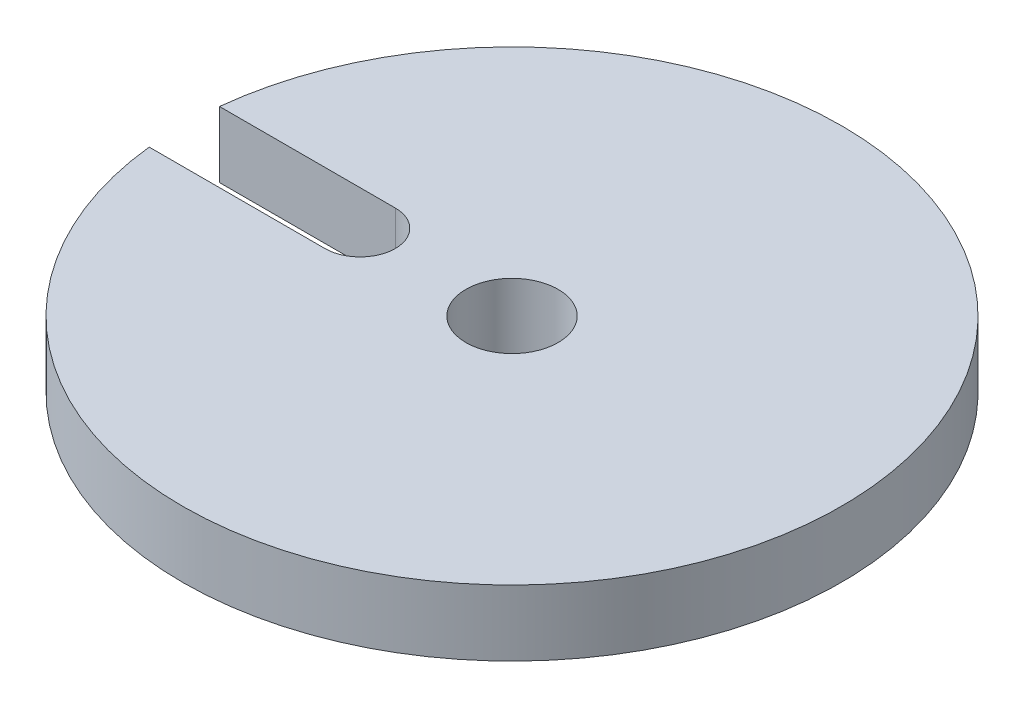
ISO-10303-21;
HEADER;
FILE_DESCRIPTION(('STEP AP214'),'2;1');
FILE_NAME('part.step','',(''),(''),'','','');
FILE_SCHEMA(('AUTOMOTIVE_DESIGN { 1 0 10303 214 1 1 1 1 }'));
ENDSEC;
DATA;
#1=APPLICATION_CONTEXT('core data for automotive mechanical design processes');
#2=APPLICATION_PROTOCOL_DEFINITION('international standard','automotive_design',2000,#1);
#3=PRODUCT_CONTEXT('',#1,'mechanical');
#4=PRODUCT('Part','Part','',(#3));
#5=PRODUCT_RELATED_PRODUCT_CATEGORY('part','',(#4));
#6=PRODUCT_DEFINITION_FORMATION('','',#4);
#7=PRODUCT_DEFINITION_CONTEXT('part definition',#1,'design');
#8=PRODUCT_DEFINITION('design','',#6,#7);
#9=PRODUCT_DEFINITION_SHAPE('','',#8);
#10=(LENGTH_UNIT() NAMED_UNIT(*) SI_UNIT(.MILLI.,.METRE.));
#11=(NAMED_UNIT(*) PLANE_ANGLE_UNIT() SI_UNIT($,.RADIAN.));
#12=(NAMED_UNIT(*) SI_UNIT($,.STERADIAN.) SOLID_ANGLE_UNIT());
#13=UNCERTAINTY_MEASURE_WITH_UNIT(LENGTH_MEASURE(1.E-05),#10,'distance_accuracy_value','');
#14=(GEOMETRIC_REPRESENTATION_CONTEXT(3) GLOBAL_UNCERTAINTY_ASSIGNED_CONTEXT((#13)) GLOBAL_UNIT_ASSIGNED_CONTEXT((#10,
#11,#12)) REPRESENTATION_CONTEXT('',''));
#15=CARTESIAN_POINT('',(0.,0.,0.));
#16=DIRECTION('',(0.,0.,1.));
#17=DIRECTION('',(1.,0.,0.));
#18=AXIS2_PLACEMENT_3D('',#15,#16,#17);
#19=CARTESIAN_POINT('',(0.,3.,0.));
#20=DIRECTION('',(0.,1.,0.));
#21=DIRECTION('',(0.,0.,1.));
#22=AXIS2_PLACEMENT_3D('',#19,#20,#21);
#23=PLANE('',#22);
#24=DIRECTION('',(-1.,0.,0.));
#25=VECTOR('',#24,1.);
#26=CARTESIAN_POINT('',(-14.9144225500017,3.,-1.6));
#27=LINE('',#26,#25);
#28=CARTESIAN_POINT('',(-6.91442255000173,3.,-1.6));
#29=VERTEX_POINT('',#28);
#30=CARTESIAN_POINT('',(-14.9144225500017,3.,-1.6));
#31=VERTEX_POINT('',#30);
#32=EDGE_CURVE('E108',#29,#31,#27,.T.);
#33=ORIENTED_EDGE('',*,*,#32,.F.);
#34=CARTESIAN_POINT('',(-6.91442255000173,3.,0.));
#35=DIRECTION('',(0.,1.,0.));
#36=DIRECTION('',(0.,0.,-1.));
#37=AXIS2_PLACEMENT_3D('',#34,#35,#36);
#38=CIRCLE('',#37,1.6);
#39=CARTESIAN_POINT('',(-6.91442255000173,3.,1.6));
#40=VERTEX_POINT('',#39);
#41=EDGE_CURVE('E90',#40,#29,#38,.T.);
#42=ORIENTED_EDGE('',*,*,#41,.F.);
#43=DIRECTION('',(1.,0.,0.));
#44=VECTOR('',#43,1.);
#45=CARTESIAN_POINT('',(-14.9144225500017,3.,1.6));
#46=LINE('',#45,#44);
#47=CARTESIAN_POINT('',(-14.9144225500017,3.,1.6));
#48=VERTEX_POINT('',#47);
#49=EDGE_CURVE('E77',#48,#40,#46,.T.);
#50=ORIENTED_EDGE('',*,*,#49,.F.);
#51=CARTESIAN_POINT('',(0.,3.,0.));
#52=DIRECTION('',(0.,1.,0.));
#53=DIRECTION('',(0.,0.,1.));
#54=AXIS2_PLACEMENT_3D('',#51,#52,#53);
#55=CIRCLE('',#54,15.);
#56=EDGE_CURVE('E83',#48,#31,#55,.T.);
#57=ORIENTED_EDGE('',*,*,#56,.T.);
#58=EDGE_LOOP('',(#33,#42,#50,#57));
#59=FACE_BOUND('',#58,.T.);
#60=CARTESIAN_POINT('',(0.,3.,0.));
#61=DIRECTION('',(0.,1.,0.));
#62=DIRECTION('',(0.,0.,1.));
#63=AXIS2_PLACEMENT_3D('',#60,#61,#62);
#64=CIRCLE('',#63,2.1);
#65=CARTESIAN_POINT('',(0.,3.,2.1));
#66=VERTEX_POINT('',#65);
#67=EDGE_CURVE('E94',#66,#66,#64,.T.);
#68=ORIENTED_EDGE('',*,*,#67,.F.);
#69=EDGE_LOOP('',(#68));
#70=FACE_BOUND('',#69,.T.);
#71=ADVANCED_FACE('F35',(#59,#70),#23,.T.);
#72=CARTESIAN_POINT('',(0.,0.,0.));
#73=DIRECTION('',(0.,1.,0.));
#74=DIRECTION('',(0.,0.,1.));
#75=AXIS2_PLACEMENT_3D('',#72,#73,#74);
#76=PLANE('',#75);
#77=CARTESIAN_POINT('',(-6.91442255000173,0.,0.));
#78=DIRECTION('',(0.,1.,0.));
#79=DIRECTION('',(0.,0.,1.));
#80=AXIS2_PLACEMENT_3D('',#77,#78,#79);
#81=CIRCLE('',#80,1.6);
#82=CARTESIAN_POINT('',(-6.91442255000173,0.,1.6));
#83=VERTEX_POINT('',#82);
#84=CARTESIAN_POINT('',(-6.91442255000173,0.,-1.6));
#85=VERTEX_POINT('',#84);
#86=EDGE_CURVE('E11',#83,#85,#81,.T.);
#87=ORIENTED_EDGE('',*,*,#86,.T.);
#88=DIRECTION('',(-1.,0.,0.));
#89=VECTOR('',#88,1.);
#90=CARTESIAN_POINT('',(0.,0.,-1.6));
#91=LINE('',#90,#89);
#92=CARTESIAN_POINT('',(-14.9144225500017,0.,-1.6));
#93=VERTEX_POINT('',#92);
#94=EDGE_CURVE('E100',#85,#93,#91,.T.);
#95=ORIENTED_EDGE('',*,*,#94,.T.);
#96=CARTESIAN_POINT('',(0.,0.,0.));
#97=DIRECTION('',(0.,1.,0.));
#98=DIRECTION('',(0.,0.,1.));
#99=AXIS2_PLACEMENT_3D('',#96,#97,#98);
#100=CIRCLE('',#99,15.);
#101=CARTESIAN_POINT('',(-14.9144225500017,0.,1.6));
#102=VERTEX_POINT('',#101);
#103=EDGE_CURVE('E92',#102,#93,#100,.T.);
#104=ORIENTED_EDGE('',*,*,#103,.F.);
#105=DIRECTION('',(1.,0.,0.));
#106=VECTOR('',#105,1.);
#107=CARTESIAN_POINT('',(0.,0.,1.6));
#108=LINE('',#107,#106);
#109=EDGE_CURVE('E50',#102,#83,#108,.T.);
#110=ORIENTED_EDGE('',*,*,#109,.T.);
#111=EDGE_LOOP('',(#87,#95,#104,#110));
#112=FACE_BOUND('',#111,.T.);
#113=CARTESIAN_POINT('',(0.,0.,0.));
#114=DIRECTION('',(0.,1.,0.));
#115=DIRECTION('',(0.,0.,1.));
#116=AXIS2_PLACEMENT_3D('',#113,#114,#115);
#117=CIRCLE('',#116,2.1);
#118=CARTESIAN_POINT('',(0.,0.,2.1));
#119=VERTEX_POINT('',#118);
#120=EDGE_CURVE('E97',#119,#119,#117,.T.);
#121=ORIENTED_EDGE('',*,*,#120,.T.);
#122=EDGE_LOOP('',(#121));
#123=FACE_BOUND('',#122,.T.);
#124=ADVANCED_FACE('F116',(#112,#123),#76,.F.);
#125=CARTESIAN_POINT('',(0.,3.,0.));
#126=DIRECTION('',(0.,-1.,0.));
#127=DIRECTION('',(0.,0.,-1.));
#128=AXIS2_PLACEMENT_3D('',#125,#126,#127);
#129=CYLINDRICAL_SURFACE('',#128,15.);
#130=ORIENTED_EDGE('',*,*,#103,.T.);
#131=DIRECTION('',(0.,-1.,0.));
#132=VECTOR('',#131,1.);
#133=CARTESIAN_POINT('',(-14.9144225500017,3.,-1.6));
#134=LINE('',#133,#132);
#135=EDGE_CURVE('E43',#93,#31,#134,.F.);
#136=ORIENTED_EDGE('',*,*,#135,.T.);
#137=ORIENTED_EDGE('',*,*,#56,.F.);
#138=DIRECTION('',(0.,-1.,0.));
#139=VECTOR('',#138,1.);
#140=CARTESIAN_POINT('',(-14.9144225500017,3.,1.6));
#141=LINE('',#140,#139);
#142=EDGE_CURVE('E74',#48,#102,#141,.T.);
#143=ORIENTED_EDGE('',*,*,#142,.T.);
#144=EDGE_LOOP('',(#130,#136,#137,#143));
#145=FACE_BOUND('',#144,.T.);
#146=ADVANCED_FACE('F37',(#145),#129,.T.);
#147=CARTESIAN_POINT('',(0.,3.,0.));
#148=DIRECTION('',(0.,-1.,0.));
#149=DIRECTION('',(0.,0.,-1.));
#150=AXIS2_PLACEMENT_3D('',#147,#148,#149);
#151=CYLINDRICAL_SURFACE('',#150,2.1);
#152=ORIENTED_EDGE('',*,*,#67,.T.);
#153=EDGE_LOOP('',(#152));
#154=FACE_BOUND('',#153,.T.);
#155=ORIENTED_EDGE('',*,*,#120,.F.);
#156=EDGE_LOOP('',(#155));
#157=FACE_BOUND('',#156,.T.);
#158=ADVANCED_FACE('F121',(#154,#157),#151,.F.);
#159=CARTESIAN_POINT('',(-6.91442255000173,-7.,0.));
#160=DIRECTION('',(0.,1.,0.));
#161=DIRECTION('',(0.,0.,1.));
#162=AXIS2_PLACEMENT_3D('',#159,#160,#161);
#163=CYLINDRICAL_SURFACE('',#162,1.6);
#164=DIRECTION('',(0.,1.,0.));
#165=VECTOR('',#164,1.);
#166=CARTESIAN_POINT('',(-6.91442255000173,-7.,1.6));
#167=LINE('',#166,#165);
#168=EDGE_CURVE('E106',#83,#40,#167,.T.);
#169=ORIENTED_EDGE('',*,*,#168,.T.);
#170=ORIENTED_EDGE('',*,*,#41,.T.);
#171=DIRECTION('',(0.,1.,0.));
#172=VECTOR('',#171,1.);
#173=CARTESIAN_POINT('',(-6.91442255000173,-7.,-1.6));
#174=LINE('',#173,#172);
#175=EDGE_CURVE('E105',#85,#29,#174,.T.);
#176=ORIENTED_EDGE('',*,*,#175,.F.);
#177=ORIENTED_EDGE('',*,*,#86,.F.);
#178=EDGE_LOOP('',(#169,#170,#176,#177));
#179=FACE_BOUND('',#178,.T.);
#180=ADVANCED_FACE('F113',(#179),#163,.F.);
#181=CARTESIAN_POINT('',(-14.9144225500017,-7.,-1.6));
#182=DIRECTION('',(0.,0.,-1.));
#183=DIRECTION('',(-1.,0.,0.));
#184=AXIS2_PLACEMENT_3D('',#181,#182,#183);
#185=PLANE('',#184);
#186=ORIENTED_EDGE('',*,*,#175,.T.);
#187=ORIENTED_EDGE('',*,*,#32,.T.);
#188=ORIENTED_EDGE('',*,*,#135,.F.);
#189=ORIENTED_EDGE('',*,*,#94,.F.);
#190=EDGE_LOOP('',(#186,#187,#188,#189));
#191=FACE_BOUND('',#190,.T.);
#192=ADVANCED_FACE('F114',(#191),#185,.F.);
#193=CARTESIAN_POINT('',(-14.9144225500017,-7.,1.6));
#194=DIRECTION('',(0.,0.,1.));
#195=DIRECTION('',(1.,0.,0.));
#196=AXIS2_PLACEMENT_3D('',#193,#194,#195);
#197=PLANE('',#196);
#198=ORIENTED_EDGE('',*,*,#142,.F.);
#199=ORIENTED_EDGE('',*,*,#49,.T.);
#200=ORIENTED_EDGE('',*,*,#168,.F.);
#201=ORIENTED_EDGE('',*,*,#109,.F.);
#202=EDGE_LOOP('',(#198,#199,#200,#201));
#203=FACE_BOUND('',#202,.T.);
#204=ADVANCED_FACE('F76',(#203),#197,.F.);
#205=CLOSED_SHELL('',(#71,#124,#146,#158,#180,#192,#204));
#206=MANIFOLD_SOLID_BREP('B2',#205);
#207=ADVANCED_BREP_SHAPE_REPRESENTATION('',(#18,#206),#14);
#208=SHAPE_DEFINITION_REPRESENTATION(#9,#207);
ENDSEC;
END-ISO-10303-21;
